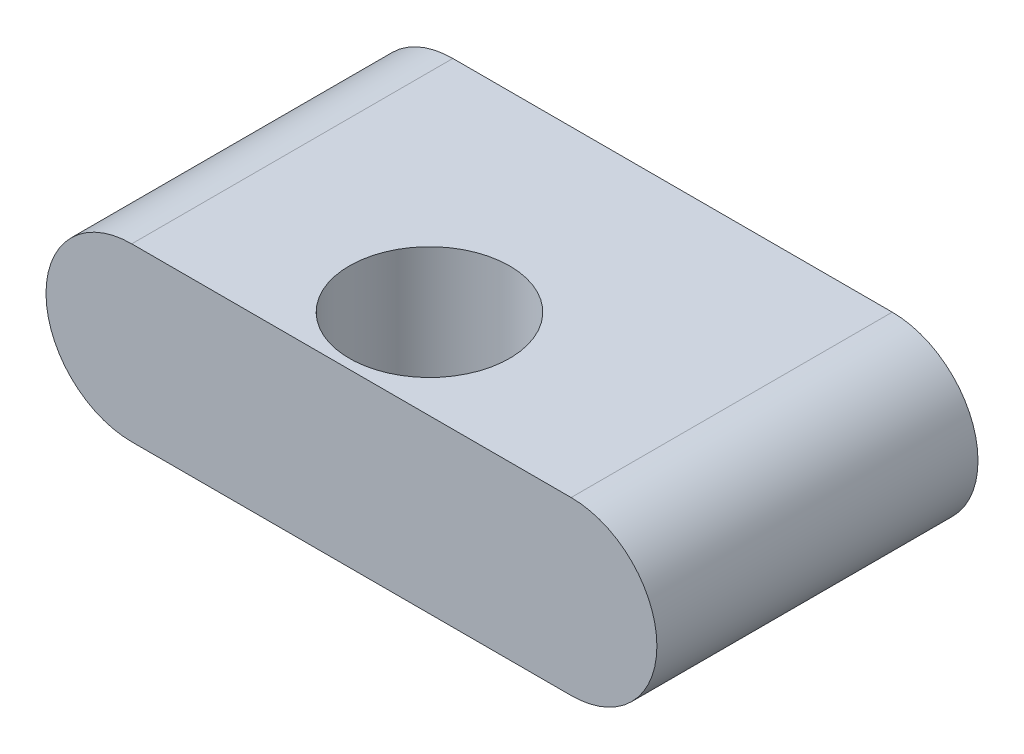
ISO-10303-21;
HEADER;
FILE_DESCRIPTION(('STEP AP214'),'2;1');
FILE_NAME('part.step','',(''),(''),'','','');
FILE_SCHEMA(('AUTOMOTIVE_DESIGN { 1 0 10303 214 1 1 1 1 }'));
ENDSEC;
DATA;
#1=APPLICATION_CONTEXT('core data for automotive mechanical design processes');
#2=APPLICATION_PROTOCOL_DEFINITION('international standard','automotive_design',2000,#1);
#3=PRODUCT_CONTEXT('',#1,'mechanical');
#4=PRODUCT('Part','Part','',(#3));
#5=PRODUCT_RELATED_PRODUCT_CATEGORY('part','',(#4));
#6=PRODUCT_DEFINITION_FORMATION('','',#4);
#7=PRODUCT_DEFINITION_CONTEXT('part definition',#1,'design');
#8=PRODUCT_DEFINITION('design','',#6,#7);
#9=PRODUCT_DEFINITION_SHAPE('','',#8);
#10=(LENGTH_UNIT() NAMED_UNIT(*) SI_UNIT(.MILLI.,.METRE.));
#11=(NAMED_UNIT(*) PLANE_ANGLE_UNIT() SI_UNIT($,.RADIAN.));
#12=(NAMED_UNIT(*) SI_UNIT($,.STERADIAN.) SOLID_ANGLE_UNIT());
#13=UNCERTAINTY_MEASURE_WITH_UNIT(LENGTH_MEASURE(1.E-05),#10,'distance_accuracy_value','');
#14=(GEOMETRIC_REPRESENTATION_CONTEXT(3) GLOBAL_UNCERTAINTY_ASSIGNED_CONTEXT((#13)) GLOBAL_UNIT_ASSIGNED_CONTEXT((#10,
#11,#12)) REPRESENTATION_CONTEXT('',''));
#15=CARTESIAN_POINT('',(0.,0.,0.));
#16=DIRECTION('',(0.,0.,1.));
#17=DIRECTION('',(1.,0.,0.));
#18=AXIS2_PLACEMENT_3D('',#15,#16,#17);
#19=CARTESIAN_POINT('',(0.,0.,-20.));
#20=DIRECTION('',(0.,0.,1.));
#21=DIRECTION('',(1.,0.,0.));
#22=AXIS2_PLACEMENT_3D('',#19,#20,#21);
#23=CYLINDRICAL_SURFACE('',#22,16.0229951635684);
#24=DIRECTION('',(0.,0.,1.));
#25=VECTOR('',#24,1.);
#26=CARTESIAN_POINT('',(0.,-16.0229951635684,-20.));
#27=LINE('',#26,#25);
#28=CARTESIAN_POINT('',(0.,-16.0229951635684,-40.));
#29=VERTEX_POINT('',#28);
#30=CARTESIAN_POINT('',(0.,-16.0229951635684,20.));
#31=VERTEX_POINT('',#30);
#32=EDGE_CURVE('E68',#29,#31,#27,.T.);
#33=ORIENTED_EDGE('',*,*,#32,.T.);
#34=CARTESIAN_POINT('',(0.,0.,20.));
#35=DIRECTION('',(0.,0.,1.));
#36=DIRECTION('',(1.,0.,0.));
#37=AXIS2_PLACEMENT_3D('',#34,#35,#36);
#38=CIRCLE('',#37,16.0229951635684);
#39=CARTESIAN_POINT('',(0.,16.0229951635684,20.));
#40=VERTEX_POINT('',#39);
#41=EDGE_CURVE('E184',#40,#31,#38,.T.);
#42=ORIENTED_EDGE('',*,*,#41,.F.);
#43=DIRECTION('',(0.,0.,1.));
#44=VECTOR('',#43,1.);
#45=CARTESIAN_POINT('',(0.,16.0229951635684,-20.));
#46=LINE('',#45,#44);
#47=CARTESIAN_POINT('',(0.,16.0229951635684,-40.));
#48=VERTEX_POINT('',#47);
#49=EDGE_CURVE('E12',#48,#40,#46,.T.);
#50=ORIENTED_EDGE('',*,*,#49,.F.);
#51=CARTESIAN_POINT('',(0.,0.,-40.));
#52=DIRECTION('',(0.,0.,-1.));
#53=DIRECTION('',(-1.,0.,0.));
#54=AXIS2_PLACEMENT_3D('',#51,#52,#53);
#55=CIRCLE('',#54,16.0229951635684);
#56=EDGE_CURVE('E147',#29,#48,#55,.T.);
#57=ORIENTED_EDGE('',*,*,#56,.F.);
#58=EDGE_LOOP('',(#33,#42,#50,#57));
#59=FACE_BOUND('',#58,.T.);
#60=ADVANCED_FACE('F65',(#59),#23,.T.);
#61=CARTESIAN_POINT('',(0.,16.0229951635684,-20.));
#62=DIRECTION('',(0.,1.,0.));
#63=DIRECTION('',(0.,0.,1.));
#64=AXIS2_PLACEMENT_3D('',#61,#62,#63);
#65=PLANE('',#64);
#66=CARTESIAN_POINT('',(38.8664671317025,16.0229951635684,3.23542298145918));
#67=DIRECTION('',(0.,-1.,0.));
#68=DIRECTION('',(0.,0.,-1.));
#69=AXIS2_PLACEMENT_3D('',#66,#67,#68);
#70=CIRCLE('',#69,14.9758608658711);
#71=CARTESIAN_POINT('',(38.8664671317025,16.0229951635684,-11.740437884412));
#72=VERTEX_POINT('',#71);
#73=EDGE_CURVE('E162',#72,#72,#70,.T.);
#74=ORIENTED_EDGE('',*,*,#73,.T.);
#75=EDGE_LOOP('',(#74));
#76=FACE_BOUND('',#75,.T.);
#77=ORIENTED_EDGE('',*,*,#49,.T.);
#78=DIRECTION('',(-1.,0.,0.));
#79=VECTOR('',#78,1.);
#80=CARTESIAN_POINT('',(0.,16.0229951635684,20.));
#81=LINE('',#80,#79);
#82=CARTESIAN_POINT('',(82.1042666242539,16.0229951635684,20.));
#83=VERTEX_POINT('',#82);
#84=EDGE_CURVE('E193',#83,#40,#81,.T.);
#85=ORIENTED_EDGE('',*,*,#84,.F.);
#86=DIRECTION('',(0.,0.,1.));
#87=VECTOR('',#86,1.);
#88=CARTESIAN_POINT('',(82.1042666242539,16.0229951635684,-20.));
#89=LINE('',#88,#87);
#90=CARTESIAN_POINT('',(82.1042666242539,16.0229951635684,-40.));
#91=VERTEX_POINT('',#90);
#92=EDGE_CURVE('E73',#91,#83,#89,.T.);
#93=ORIENTED_EDGE('',*,*,#92,.F.);
#94=DIRECTION('',(1.,0.,0.));
#95=VECTOR('',#94,1.);
#96=CARTESIAN_POINT('',(0.,16.0229951635684,-40.));
#97=LINE('',#96,#95);
#98=EDGE_CURVE('E175',#48,#91,#97,.T.);
#99=ORIENTED_EDGE('',*,*,#98,.F.);
#100=EDGE_LOOP('',(#77,#85,#93,#99));
#101=FACE_BOUND('',#100,.T.);
#102=ADVANCED_FACE('F206',(#76,#101),#65,.T.);
#103=CARTESIAN_POINT('',(82.1042666242539,0.,-20.));
#104=DIRECTION('',(0.,0.,1.));
#105=DIRECTION('',(1.,0.,0.));
#106=AXIS2_PLACEMENT_3D('',#103,#104,#105);
#107=CYLINDRICAL_SURFACE('',#106,16.0229951635684);
#108=ORIENTED_EDGE('',*,*,#92,.T.);
#109=CARTESIAN_POINT('',(82.1042666242539,0.,20.));
#110=DIRECTION('',(0.,0.,1.));
#111=DIRECTION('',(1.,0.,0.));
#112=AXIS2_PLACEMENT_3D('',#109,#110,#111);
#113=CIRCLE('',#112,16.0229951635684);
#114=CARTESIAN_POINT('',(82.1042666242539,-16.0229951635684,20.));
#115=VERTEX_POINT('',#114);
#116=EDGE_CURVE('E190',#115,#83,#113,.T.);
#117=ORIENTED_EDGE('',*,*,#116,.F.);
#118=DIRECTION('',(0.,0.,1.));
#119=VECTOR('',#118,1.);
#120=CARTESIAN_POINT('',(82.1042666242539,-16.0229951635684,-20.));
#121=LINE('',#120,#119);
#122=CARTESIAN_POINT('',(82.1042666242539,-16.0229951635684,-40.));
#123=VERTEX_POINT('',#122);
#124=EDGE_CURVE('E195',#123,#115,#121,.T.);
#125=ORIENTED_EDGE('',*,*,#124,.F.);
#126=CARTESIAN_POINT('',(82.1042666242539,0.,-40.));
#127=DIRECTION('',(0.,0.,-1.));
#128=DIRECTION('',(-1.,0.,0.));
#129=AXIS2_PLACEMENT_3D('',#126,#127,#128);
#130=CIRCLE('',#129,16.0229951635684);
#131=EDGE_CURVE('E178',#91,#123,#130,.T.);
#132=ORIENTED_EDGE('',*,*,#131,.F.);
#133=EDGE_LOOP('',(#108,#117,#125,#132));
#134=FACE_BOUND('',#133,.T.);
#135=ADVANCED_FACE('F210',(#134),#107,.T.);
#136=CARTESIAN_POINT('',(0.,-16.0229951635684,-20.));
#137=DIRECTION('',(0.,-1.,0.));
#138=DIRECTION('',(0.,0.,-1.));
#139=AXIS2_PLACEMENT_3D('',#136,#137,#138);
#140=PLANE('',#139);
#141=CARTESIAN_POINT('',(38.8664671317025,-16.0229951635684,3.23542298145918));
#142=DIRECTION('',(0.,-1.,0.));
#143=DIRECTION('',(0.,0.,-1.));
#144=AXIS2_PLACEMENT_3D('',#141,#142,#143);
#145=CIRCLE('',#144,14.9758608658711);
#146=CARTESIAN_POINT('',(38.8664671317025,-16.0229951635684,-11.740437884412));
#147=VERTEX_POINT('',#146);
#148=EDGE_CURVE('E332',#147,#147,#145,.T.);
#149=ORIENTED_EDGE('',*,*,#148,.F.);
#150=EDGE_LOOP('',(#149));
#151=FACE_BOUND('',#150,.T.);
#152=ORIENTED_EDGE('',*,*,#124,.T.);
#153=DIRECTION('',(1.,0.,0.));
#154=VECTOR('',#153,1.);
#155=CARTESIAN_POINT('',(0.,-16.0229951635684,20.));
#156=LINE('',#155,#154);
#157=EDGE_CURVE('E187',#31,#115,#156,.T.);
#158=ORIENTED_EDGE('',*,*,#157,.F.);
#159=ORIENTED_EDGE('',*,*,#32,.F.);
#160=DIRECTION('',(-1.,0.,0.));
#161=VECTOR('',#160,1.);
#162=CARTESIAN_POINT('',(82.1042666242539,-16.0229951635684,-40.));
#163=LINE('',#162,#161);
#164=EDGE_CURVE('E181',#123,#29,#163,.T.);
#165=ORIENTED_EDGE('',*,*,#164,.F.);
#166=EDGE_LOOP('',(#152,#158,#159,#165));
#167=FACE_BOUND('',#166,.T.);
#168=ADVANCED_FACE('F202',(#151,#167),#140,.T.);
#169=CARTESIAN_POINT('',(0.,0.,20.));
#170=DIRECTION('',(0.,0.,1.));
#171=DIRECTION('',(1.,0.,0.));
#172=AXIS2_PLACEMENT_3D('',#169,#170,#171);
#173=PLANE('',#172);
#174=ORIENTED_EDGE('',*,*,#41,.T.);
#175=ORIENTED_EDGE('',*,*,#157,.T.);
#176=ORIENTED_EDGE('',*,*,#116,.T.);
#177=ORIENTED_EDGE('',*,*,#84,.T.);
#178=EDGE_LOOP('',(#174,#175,#176,#177));
#179=FACE_BOUND('',#178,.T.);
#180=ADVANCED_FACE('F205',(#179),#173,.T.);
#181=CARTESIAN_POINT('',(0.,0.,-40.));
#182=DIRECTION('',(0.,0.,-1.));
#183=DIRECTION('',(-1.,0.,0.));
#184=AXIS2_PLACEMENT_3D('',#181,#182,#183);
#185=PLANE('',#184);
#186=ORIENTED_EDGE('',*,*,#56,.T.);
#187=ORIENTED_EDGE('',*,*,#98,.T.);
#188=ORIENTED_EDGE('',*,*,#131,.T.);
#189=ORIENTED_EDGE('',*,*,#164,.T.);
#190=EDGE_LOOP('',(#186,#187,#188,#189));
#191=FACE_BOUND('',#190,.T.);
#192=DIRECTION('',(1.,0.,0.));
#193=VECTOR('',#192,1.);
#194=CARTESIAN_POINT('',(0.,11.0229951635684,-40.));
#195=LINE('',#194,#193);
#196=CARTESIAN_POINT('',(0.,11.0229951635684,-40.));
#197=VERTEX_POINT('',#196);
#198=CARTESIAN_POINT('',(82.1042666242539,11.0229951635684,-40.));
#199=VERTEX_POINT('',#198);
#200=EDGE_CURVE('E139',#197,#199,#195,.T.);
#201=ORIENTED_EDGE('',*,*,#200,.F.);
#202=CARTESIAN_POINT('',(0.,0.,-40.));
#203=DIRECTION('',(0.,0.,-1.));
#204=DIRECTION('',(-1.,0.,0.));
#205=AXIS2_PLACEMENT_3D('',#202,#203,#204);
#206=CIRCLE('',#205,11.0229951635684);
#207=CARTESIAN_POINT('',(0.,-11.0229951635684,-40.));
#208=VERTEX_POINT('',#207);
#209=EDGE_CURVE('E131',#208,#197,#206,.T.);
#210=ORIENTED_EDGE('',*,*,#209,.F.);
#211=DIRECTION('',(-1.,0.,0.));
#212=VECTOR('',#211,1.);
#213=CARTESIAN_POINT('',(82.1042666242539,-11.0229951635684,-40.));
#214=LINE('',#213,#212);
#215=CARTESIAN_POINT('',(82.1042666242539,-11.0229951635684,-40.));
#216=VERTEX_POINT('',#215);
#217=EDGE_CURVE('E155',#216,#208,#214,.T.);
#218=ORIENTED_EDGE('',*,*,#217,.F.);
#219=CARTESIAN_POINT('',(82.1042666242539,0.,-40.));
#220=DIRECTION('',(0.,0.,-1.));
#221=DIRECTION('',(-1.,0.,0.));
#222=AXIS2_PLACEMENT_3D('',#219,#220,#221);
#223=CIRCLE('',#222,11.0229951635684);
#224=EDGE_CURVE('E153',#199,#216,#223,.T.);
#225=ORIENTED_EDGE('',*,*,#224,.F.);
#226=EDGE_LOOP('',(#201,#210,#218,#225));
#227=FACE_BOUND('',#226,.T.);
#228=ADVANCED_FACE('F151',(#191,#227),#185,.T.);
#229=CARTESIAN_POINT('',(0.,0.,-40.));
#230=DIRECTION('',(0.,0.,1.));
#231=DIRECTION('',(1.,0.,0.));
#232=AXIS2_PLACEMENT_3D('',#229,#230,#231);
#233=CYLINDRICAL_SURFACE('',#232,11.0229951635684);
#234=CARTESIAN_POINT('',(0.,0.,-20.));
#235=DIRECTION('',(0.,0.,-1.));
#236=DIRECTION('',(-1.,0.,0.));
#237=AXIS2_PLACEMENT_3D('',#234,#235,#236);
#238=CIRCLE('',#237,11.0229951635684);
#239=CARTESIAN_POINT('',(0.,-11.0229951635684,-20.));
#240=VERTEX_POINT('',#239);
#241=CARTESIAN_POINT('',(0.,11.0229951635684,-20.));
#242=VERTEX_POINT('',#241);
#243=EDGE_CURVE('E160',#240,#242,#238,.T.);
#244=ORIENTED_EDGE('',*,*,#243,.F.);
#245=DIRECTION('',(0.,0.,1.));
#246=VECTOR('',#245,1.);
#247=CARTESIAN_POINT('',(0.,-11.0229951635684,-40.));
#248=LINE('',#247,#246);
#249=EDGE_CURVE('E81',#208,#240,#248,.T.);
#250=ORIENTED_EDGE('',*,*,#249,.F.);
#251=ORIENTED_EDGE('',*,*,#209,.T.);
#252=DIRECTION('',(0.,0.,1.));
#253=VECTOR('',#252,1.);
#254=CARTESIAN_POINT('',(0.,11.0229951635684,-40.));
#255=LINE('',#254,#253);
#256=EDGE_CURVE('E134',#197,#242,#255,.T.);
#257=ORIENTED_EDGE('',*,*,#256,.T.);
#258=EDGE_LOOP('',(#244,#250,#251,#257));
#259=FACE_BOUND('',#258,.T.);
#260=ADVANCED_FACE('F133',(#259),#233,.F.);
#261=CARTESIAN_POINT('',(0.,11.0229951635684,-40.));
#262=DIRECTION('',(0.,-1.,0.));
#263=DIRECTION('',(0.,0.,-1.));
#264=AXIS2_PLACEMENT_3D('',#261,#262,#263);
#265=PLANE('',#264);
#266=DIRECTION('',(1.,0.,0.));
#267=VECTOR('',#266,1.);
#268=CARTESIAN_POINT('',(0.,11.0229951635684,-20.));
#269=LINE('',#268,#267);
#270=CARTESIAN_POINT('',(82.1042666242539,11.0229951635684,-20.));
#271=VERTEX_POINT('',#270);
#272=EDGE_CURVE('E146',#242,#271,#269,.T.);
#273=ORIENTED_EDGE('',*,*,#272,.F.);
#274=ORIENTED_EDGE('',*,*,#256,.F.);
#275=ORIENTED_EDGE('',*,*,#200,.T.);
#276=DIRECTION('',(0.,0.,1.));
#277=VECTOR('',#276,1.);
#278=CARTESIAN_POINT('',(82.1042666242539,11.0229951635684,-40.));
#279=LINE('',#278,#277);
#280=EDGE_CURVE('E148',#199,#271,#279,.T.);
#281=ORIENTED_EDGE('',*,*,#280,.T.);
#282=EDGE_LOOP('',(#273,#274,#275,#281));
#283=FACE_BOUND('',#282,.T.);
#284=ADVANCED_FACE('F143',(#283),#265,.T.);
#285=CARTESIAN_POINT('',(82.1042666242539,0.,-40.));
#286=DIRECTION('',(0.,0.,1.));
#287=DIRECTION('',(1.,0.,0.));
#288=AXIS2_PLACEMENT_3D('',#285,#286,#287);
#289=CYLINDRICAL_SURFACE('',#288,11.0229951635684);
#290=CARTESIAN_POINT('',(82.1042666242539,0.,-20.));
#291=DIRECTION('',(0.,0.,-1.));
#292=DIRECTION('',(-1.,0.,0.));
#293=AXIS2_PLACEMENT_3D('',#290,#291,#292);
#294=CIRCLE('',#293,11.0229951635684);
#295=CARTESIAN_POINT('',(82.1042666242539,-11.0229951635684,-20.));
#296=VERTEX_POINT('',#295);
#297=EDGE_CURVE('E164',#271,#296,#294,.T.);
#298=ORIENTED_EDGE('',*,*,#297,.F.);
#299=ORIENTED_EDGE('',*,*,#280,.F.);
#300=ORIENTED_EDGE('',*,*,#224,.T.);
#301=DIRECTION('',(0.,0.,1.));
#302=VECTOR('',#301,1.);
#303=CARTESIAN_POINT('',(82.1042666242539,-11.0229951635684,-40.));
#304=LINE('',#303,#302);
#305=EDGE_CURVE('E170',#216,#296,#304,.T.);
#306=ORIENTED_EDGE('',*,*,#305,.T.);
#307=EDGE_LOOP('',(#298,#299,#300,#306));
#308=FACE_BOUND('',#307,.T.);
#309=ADVANCED_FACE('F293',(#308),#289,.F.);
#310=CARTESIAN_POINT('',(82.1042666242539,-11.0229951635684,-40.));
#311=DIRECTION('',(0.,1.,0.));
#312=DIRECTION('',(0.,0.,1.));
#313=AXIS2_PLACEMENT_3D('',#310,#311,#312);
#314=PLANE('',#313);
#315=DIRECTION('',(-1.,0.,0.));
#316=VECTOR('',#315,1.);
#317=CARTESIAN_POINT('',(82.1042666242539,-11.0229951635684,-20.));
#318=LINE('',#317,#316);
#319=EDGE_CURVE('E140',#296,#240,#318,.T.);
#320=ORIENTED_EDGE('',*,*,#319,.F.);
#321=ORIENTED_EDGE('',*,*,#305,.F.);
#322=ORIENTED_EDGE('',*,*,#217,.T.);
#323=ORIENTED_EDGE('',*,*,#249,.T.);
#324=EDGE_LOOP('',(#320,#321,#322,#323));
#325=FACE_BOUND('',#324,.T.);
#326=ADVANCED_FACE('F245',(#325),#314,.T.);
#327=CARTESIAN_POINT('',(0.,0.,-20.));
#328=DIRECTION('',(0.,0.,1.));
#329=DIRECTION('',(1.,0.,0.));
#330=AXIS2_PLACEMENT_3D('',#327,#328,#329);
#331=PLANE('',#330);
#332=ORIENTED_EDGE('',*,*,#319,.T.);
#333=ORIENTED_EDGE('',*,*,#243,.T.);
#334=ORIENTED_EDGE('',*,*,#272,.T.);
#335=ORIENTED_EDGE('',*,*,#297,.T.);
#336=EDGE_LOOP('',(#332,#333,#334,#335));
#337=FACE_BOUND('',#336,.T.);
#338=ADVANCED_FACE('F239',(#337),#331,.F.);
#339=CARTESIAN_POINT('',(38.8664671317025,16.0229951635684,3.23542298145918));
#340=DIRECTION('',(0.,-1.,0.));
#341=DIRECTION('',(0.,0.,-1.));
#342=AXIS2_PLACEMENT_3D('',#339,#340,#341);
#343=CYLINDRICAL_SURFACE('',#342,14.9758608658711);
#344=ORIENTED_EDGE('',*,*,#73,.F.);
#345=EDGE_LOOP('',(#344));
#346=FACE_BOUND('',#345,.T.);
#347=ORIENTED_EDGE('',*,*,#148,.T.);
#348=EDGE_LOOP('',(#347));
#349=FACE_BOUND('',#348,.T.);
#350=ADVANCED_FACE('F244',(#346,#349),#343,.F.);
#351=CLOSED_SHELL('',(#60,#102,#135,#168,#180,#228,#260,#284,#309,#326,#338,#350));
#352=MANIFOLD_SOLID_BREP('B2',#351);
#353=ADVANCED_BREP_SHAPE_REPRESENTATION('',(#18,#352),#14);
#354=SHAPE_DEFINITION_REPRESENTATION(#9,#353);
ENDSEC;
END-ISO-10303-21;
